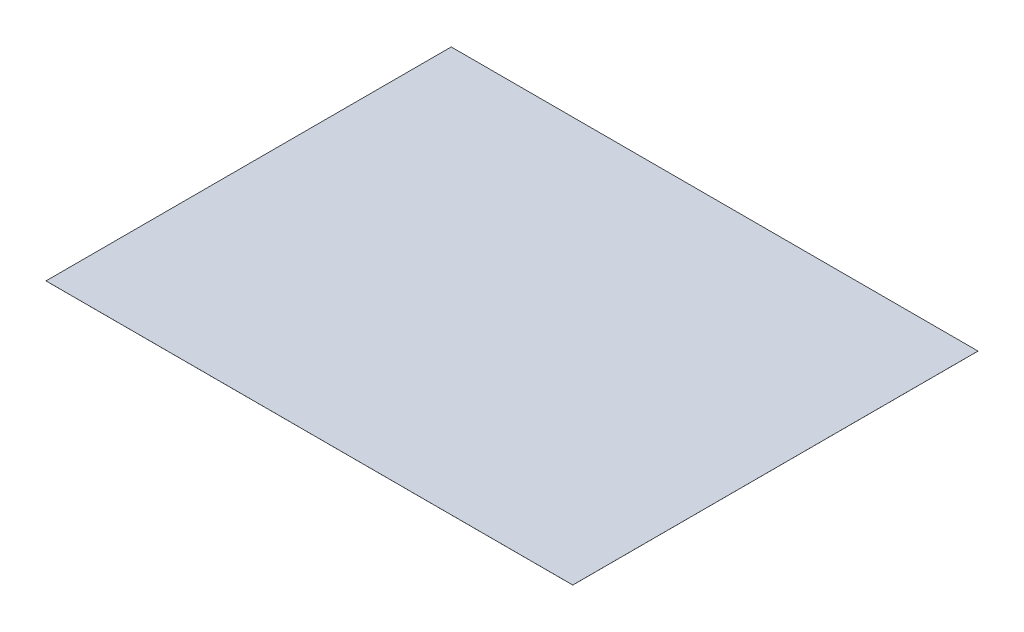
ISO-10303-21;
HEADER;
FILE_DESCRIPTION(('STEP AP214'),'2;1');
FILE_NAME('part.step','',(''),(''),'','','');
FILE_SCHEMA(('AUTOMOTIVE_DESIGN { 1 0 10303 214 1 1 1 1 }'));
ENDSEC;
DATA;
#1=APPLICATION_CONTEXT('core data for automotive mechanical design processes');
#2=APPLICATION_PROTOCOL_DEFINITION('international standard','automotive_design',2000,#1);
#3=PRODUCT_CONTEXT('',#1,'mechanical');
#4=PRODUCT('Part','Part','',(#3));
#5=PRODUCT_RELATED_PRODUCT_CATEGORY('part','',(#4));
#6=PRODUCT_DEFINITION_FORMATION('','',#4);
#7=PRODUCT_DEFINITION_CONTEXT('part definition',#1,'design');
#8=PRODUCT_DEFINITION('design','',#6,#7);
#9=PRODUCT_DEFINITION_SHAPE('','',#8);
#10=(LENGTH_UNIT() NAMED_UNIT(*) SI_UNIT(.MILLI.,.METRE.));
#11=(NAMED_UNIT(*) PLANE_ANGLE_UNIT() SI_UNIT($,.RADIAN.));
#12=(NAMED_UNIT(*) SI_UNIT($,.STERADIAN.) SOLID_ANGLE_UNIT());
#13=UNCERTAINTY_MEASURE_WITH_UNIT(LENGTH_MEASURE(1.E-05),#10,'distance_accuracy_value','');
#14=(GEOMETRIC_REPRESENTATION_CONTEXT(3) GLOBAL_UNCERTAINTY_ASSIGNED_CONTEXT((#13)) GLOBAL_UNIT_ASSIGNED_CONTEXT((#10,
#11,#12)) REPRESENTATION_CONTEXT('',''));
#15=CARTESIAN_POINT('',(0.,0.,0.));
#16=DIRECTION('',(0.,0.,1.));
#17=DIRECTION('',(1.,0.,0.));
#18=AXIS2_PLACEMENT_3D('',#15,#16,#17);
#19=CARTESIAN_POINT('',(650.,0.1,500.));
#20=DIRECTION('',(-1.,0.,0.));
#21=DIRECTION('',(0.,0.,1.));
#22=AXIS2_PLACEMENT_3D('',#19,#20,#21);
#23=PLANE('',#22);
#24=DIRECTION('',(0.,0.,-1.));
#25=VECTOR('',#24,1.);
#26=CARTESIAN_POINT('',(650.,0.,500.));
#27=LINE('',#26,#25);
#28=CARTESIAN_POINT('',(650.,0.,500.));
#29=VERTEX_POINT('',#28);
#30=CARTESIAN_POINT('',(650.,0.,-500.));
#31=VERTEX_POINT('',#30);
#32=EDGE_CURVE('E97',#29,#31,#27,.T.);
#33=ORIENTED_EDGE('',*,*,#32,.T.);
#34=DIRECTION('',(0.,-1.,0.));
#35=VECTOR('',#34,1.);
#36=CARTESIAN_POINT('',(650.,0.1,-500.));
#37=LINE('',#36,#35);
#38=CARTESIAN_POINT('',(650.,0.1,-500.));
#39=VERTEX_POINT('',#38);
#40=EDGE_CURVE('E11',#39,#31,#37,.T.);
#41=ORIENTED_EDGE('',*,*,#40,.F.);
#42=DIRECTION('',(0.,0.,-1.));
#43=VECTOR('',#42,1.);
#44=CARTESIAN_POINT('',(650.,0.1,500.));
#45=LINE('',#44,#43);
#46=CARTESIAN_POINT('',(650.,0.1,500.));
#47=VERTEX_POINT('',#46);
#48=EDGE_CURVE('E85',#47,#39,#45,.T.);
#49=ORIENTED_EDGE('',*,*,#48,.F.);
#50=DIRECTION('',(0.,-1.,0.));
#51=VECTOR('',#50,1.);
#52=CARTESIAN_POINT('',(650.,0.1,500.));
#53=LINE('',#52,#51);
#54=EDGE_CURVE('E93',#47,#29,#53,.T.);
#55=ORIENTED_EDGE('',*,*,#54,.T.);
#56=EDGE_LOOP('',(#33,#41,#49,#55));
#57=FACE_BOUND('',#56,.T.);
#58=ADVANCED_FACE('F34',(#57),#23,.F.);
#59=CARTESIAN_POINT('',(-650.,0.1,-500.));
#60=DIRECTION('',(0.,0.,1.));
#61=DIRECTION('',(1.,0.,0.));
#62=AXIS2_PLACEMENT_3D('',#59,#60,#61);
#63=PLANE('',#62);
#64=DIRECTION('',(-1.,0.,0.));
#65=VECTOR('',#64,1.);
#66=CARTESIAN_POINT('',(-650.,0.,-500.));
#67=LINE('',#66,#65);
#68=CARTESIAN_POINT('',(-650.,0.,-500.));
#69=VERTEX_POINT('',#68);
#70=EDGE_CURVE('E89',#31,#69,#67,.T.);
#71=ORIENTED_EDGE('',*,*,#70,.T.);
#72=DIRECTION('',(0.,-1.,0.));
#73=VECTOR('',#72,1.);
#74=CARTESIAN_POINT('',(-650.,0.1,-500.));
#75=LINE('',#74,#73);
#76=CARTESIAN_POINT('',(-650.,0.1,-500.));
#77=VERTEX_POINT('',#76);
#78=EDGE_CURVE('E42',#77,#69,#75,.T.);
#79=ORIENTED_EDGE('',*,*,#78,.F.);
#80=DIRECTION('',(-1.,0.,0.));
#81=VECTOR('',#80,1.);
#82=CARTESIAN_POINT('',(-650.,0.1,-500.));
#83=LINE('',#82,#81);
#84=EDGE_CURVE('E80',#39,#77,#83,.T.);
#85=ORIENTED_EDGE('',*,*,#84,.F.);
#86=ORIENTED_EDGE('',*,*,#40,.T.);
#87=EDGE_LOOP('',(#71,#79,#85,#86));
#88=FACE_BOUND('',#87,.T.);
#89=ADVANCED_FACE('F88',(#88),#63,.F.);
#90=CARTESIAN_POINT('',(-650.,0.1,500.));
#91=DIRECTION('',(1.,0.,0.));
#92=DIRECTION('',(0.,0.,-1.));
#93=AXIS2_PLACEMENT_3D('',#90,#91,#92);
#94=PLANE('',#93);
#95=DIRECTION('',(0.,0.,1.));
#96=VECTOR('',#95,1.);
#97=CARTESIAN_POINT('',(-650.,0.,500.));
#98=LINE('',#97,#96);
#99=CARTESIAN_POINT('',(-650.,0.,500.));
#100=VERTEX_POINT('',#99);
#101=EDGE_CURVE('E67',#69,#100,#98,.T.);
#102=ORIENTED_EDGE('',*,*,#101,.T.);
#103=DIRECTION('',(0.,-1.,0.));
#104=VECTOR('',#103,1.);
#105=CARTESIAN_POINT('',(-650.,0.1,500.));
#106=LINE('',#105,#104);
#107=CARTESIAN_POINT('',(-650.,0.1,500.));
#108=VERTEX_POINT('',#107);
#109=EDGE_CURVE('E90',#108,#100,#106,.T.);
#110=ORIENTED_EDGE('',*,*,#109,.F.);
#111=DIRECTION('',(0.,0.,1.));
#112=VECTOR('',#111,1.);
#113=CARTESIAN_POINT('',(-650.,0.1,500.));
#114=LINE('',#113,#112);
#115=EDGE_CURVE('E83',#77,#108,#114,.T.);
#116=ORIENTED_EDGE('',*,*,#115,.F.);
#117=ORIENTED_EDGE('',*,*,#78,.T.);
#118=EDGE_LOOP('',(#102,#110,#116,#117));
#119=FACE_BOUND('',#118,.T.);
#120=ADVANCED_FACE('F91',(#119),#94,.F.);
#121=CARTESIAN_POINT('',(-650.,0.1,500.));
#122=DIRECTION('',(0.,0.,-1.));
#123=DIRECTION('',(-1.,0.,0.));
#124=AXIS2_PLACEMENT_3D('',#121,#122,#123);
#125=PLANE('',#124);
#126=DIRECTION('',(1.,0.,0.));
#127=VECTOR('',#126,1.);
#128=CARTESIAN_POINT('',(-650.,0.,500.));
#129=LINE('',#128,#127);
#130=EDGE_CURVE('E73',#100,#29,#129,.T.);
#131=ORIENTED_EDGE('',*,*,#130,.T.);
#132=ORIENTED_EDGE('',*,*,#54,.F.);
#133=DIRECTION('',(1.,0.,0.));
#134=VECTOR('',#133,1.);
#135=CARTESIAN_POINT('',(-650.,0.1,500.));
#136=LINE('',#135,#134);
#137=EDGE_CURVE('E50',#108,#47,#136,.T.);
#138=ORIENTED_EDGE('',*,*,#137,.F.);
#139=ORIENTED_EDGE('',*,*,#109,.T.);
#140=EDGE_LOOP('',(#131,#132,#138,#139));
#141=FACE_BOUND('',#140,.T.);
#142=ADVANCED_FACE('F104',(#141),#125,.F.);
#143=CARTESIAN_POINT('',(0.,0.1,0.));
#144=DIRECTION('',(0.,-1.,0.));
#145=DIRECTION('',(0.,0.,-1.));
#146=AXIS2_PLACEMENT_3D('',#143,#144,#145);
#147=PLANE('',#146);
#148=ORIENTED_EDGE('',*,*,#48,.T.);
#149=ORIENTED_EDGE('',*,*,#84,.T.);
#150=ORIENTED_EDGE('',*,*,#115,.T.);
#151=ORIENTED_EDGE('',*,*,#137,.T.);
#152=EDGE_LOOP('',(#148,#149,#150,#151));
#153=FACE_BOUND('',#152,.T.);
#154=ADVANCED_FACE('F81',(#153),#147,.F.);
#155=CARTESIAN_POINT('',(0.,0.,0.));
#156=DIRECTION('',(0.,-1.,0.));
#157=DIRECTION('',(0.,0.,-1.));
#158=AXIS2_PLACEMENT_3D('',#155,#156,#157);
#159=PLANE('',#158);
#160=ORIENTED_EDGE('',*,*,#32,.F.);
#161=ORIENTED_EDGE('',*,*,#130,.F.);
#162=ORIENTED_EDGE('',*,*,#101,.F.);
#163=ORIENTED_EDGE('',*,*,#70,.F.);
#164=EDGE_LOOP('',(#160,#161,#162,#163));
#165=FACE_BOUND('',#164,.T.);
#166=ADVANCED_FACE('F107',(#165),#159,.T.);
#167=CLOSED_SHELL('',(#58,#89,#120,#142,#154,#166));
#168=MANIFOLD_SOLID_BREP('B2',#167);
#169=ADVANCED_BREP_SHAPE_REPRESENTATION('',(#18,#168),#14);
#170=SHAPE_DEFINITION_REPRESENTATION(#9,#169);
ENDSEC;
END-ISO-10303-21;
